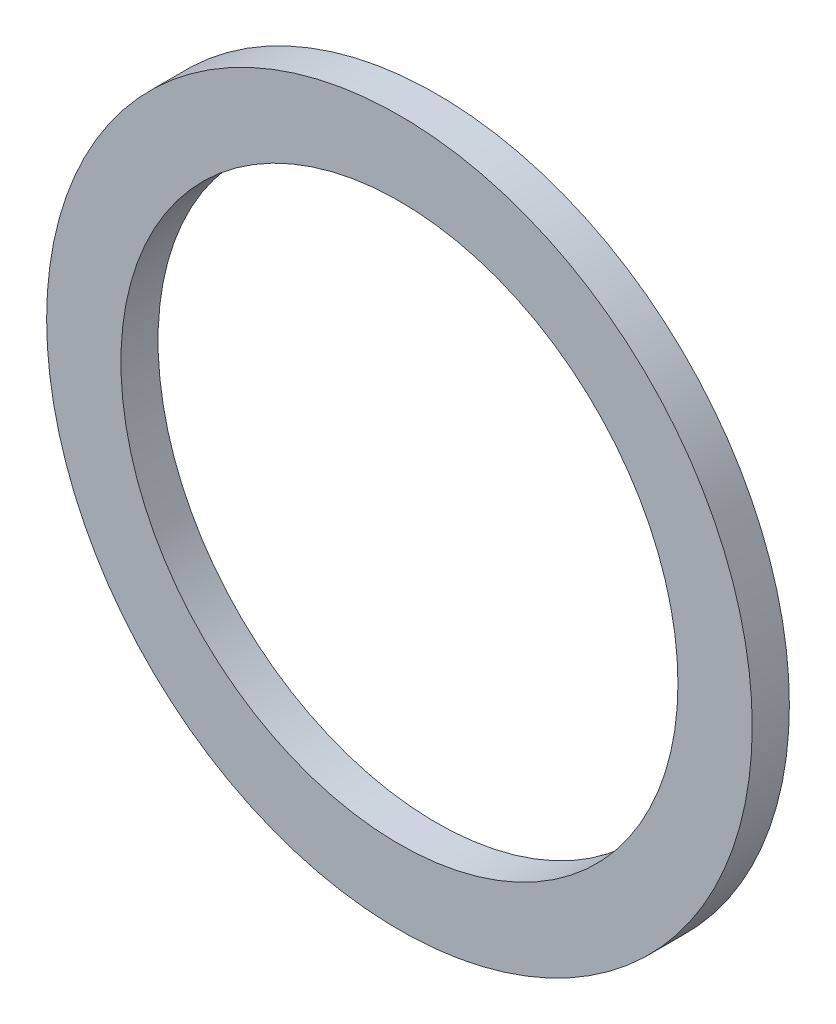
ISO-10303-21;
HEADER;
FILE_DESCRIPTION(('STEP AP214'),'2;1');
FILE_NAME('part.step','',(''),(''),'','','');
FILE_SCHEMA(('AUTOMOTIVE_DESIGN { 1 0 10303 214 1 1 1 1 }'));
ENDSEC;
DATA;
#1=APPLICATION_CONTEXT('core data for automotive mechanical design processes');
#2=APPLICATION_PROTOCOL_DEFINITION('international standard','automotive_design',2000,#1);
#3=PRODUCT_CONTEXT('',#1,'mechanical');
#4=PRODUCT('Part','Part','',(#3));
#5=PRODUCT_RELATED_PRODUCT_CATEGORY('part','',(#4));
#6=PRODUCT_DEFINITION_FORMATION('','',#4);
#7=PRODUCT_DEFINITION_CONTEXT('part definition',#1,'design');
#8=PRODUCT_DEFINITION('design','',#6,#7);
#9=PRODUCT_DEFINITION_SHAPE('','',#8);
#10=(LENGTH_UNIT() NAMED_UNIT(*) SI_UNIT(.MILLI.,.METRE.));
#11=(NAMED_UNIT(*) PLANE_ANGLE_UNIT() SI_UNIT($,.RADIAN.));
#12=(NAMED_UNIT(*) SI_UNIT($,.STERADIAN.) SOLID_ANGLE_UNIT());
#13=UNCERTAINTY_MEASURE_WITH_UNIT(LENGTH_MEASURE(1.E-05),#10,'distance_accuracy_value','');
#14=(GEOMETRIC_REPRESENTATION_CONTEXT(3) GLOBAL_UNCERTAINTY_ASSIGNED_CONTEXT((#13)) GLOBAL_UNIT_ASSIGNED_CONTEXT((#10,
#11,#12)) REPRESENTATION_CONTEXT('',''));
#15=CARTESIAN_POINT('',(0.,0.,0.));
#16=DIRECTION('',(0.,0.,1.));
#17=DIRECTION('',(1.,0.,0.));
#18=AXIS2_PLACEMENT_3D('',#15,#16,#17);
#19=CARTESIAN_POINT('',(0.,0.,2.));
#20=DIRECTION('',(0.,0.,1.));
#21=DIRECTION('',(1.,0.,0.));
#22=AXIS2_PLACEMENT_3D('',#19,#20,#21);
#23=PLANE('',#22);
#24=CARTESIAN_POINT('',(0.,0.,2.));
#25=DIRECTION('',(0.,0.,1.));
#26=DIRECTION('',(1.,0.,0.));
#27=AXIS2_PLACEMENT_3D('',#24,#25,#26);
#28=CIRCLE('',#27,19.);
#29=CARTESIAN_POINT('',(19.,0.,2.));
#30=VERTEX_POINT('',#29);
#31=EDGE_CURVE('E10',#30,#30,#28,.T.);
#32=ORIENTED_EDGE('',*,*,#31,.T.);
#33=EDGE_LOOP('',(#32));
#34=FACE_BOUND('',#33,.T.);
#35=CARTESIAN_POINT('',(0.,0.,2.));
#36=DIRECTION('',(0.,0.,1.));
#37=DIRECTION('',(1.,0.,0.));
#38=AXIS2_PLACEMENT_3D('',#35,#36,#37);
#39=CIRCLE('',#38,15.);
#40=CARTESIAN_POINT('',(15.,0.,2.));
#41=VERTEX_POINT('',#40);
#42=EDGE_CURVE('E40',#41,#41,#39,.T.);
#43=ORIENTED_EDGE('',*,*,#42,.F.);
#44=EDGE_LOOP('',(#43));
#45=FACE_BOUND('',#44,.T.);
#46=ADVANCED_FACE('F29',(#34,#45),#23,.T.);
#47=CARTESIAN_POINT('',(0.,0.,0.));
#48=DIRECTION('',(0.,0.,1.));
#49=DIRECTION('',(1.,0.,0.));
#50=AXIS2_PLACEMENT_3D('',#47,#48,#49);
#51=PLANE('',#50);
#52=CARTESIAN_POINT('',(0.,0.,0.));
#53=DIRECTION('',(0.,0.,1.));
#54=DIRECTION('',(1.,0.,0.));
#55=AXIS2_PLACEMENT_3D('',#52,#53,#54);
#56=CIRCLE('',#55,19.);
#57=CARTESIAN_POINT('',(19.,0.,0.));
#58=VERTEX_POINT('',#57);
#59=EDGE_CURVE('E33',#58,#58,#56,.T.);
#60=ORIENTED_EDGE('',*,*,#59,.F.);
#61=EDGE_LOOP('',(#60));
#62=FACE_BOUND('',#61,.T.);
#63=CARTESIAN_POINT('',(0.,0.,0.));
#64=DIRECTION('',(0.,0.,1.));
#65=DIRECTION('',(1.,0.,0.));
#66=AXIS2_PLACEMENT_3D('',#63,#64,#65);
#67=CIRCLE('',#66,15.);
#68=CARTESIAN_POINT('',(15.,0.,0.));
#69=VERTEX_POINT('',#68);
#70=EDGE_CURVE('E42',#69,#69,#67,.T.);
#71=ORIENTED_EDGE('',*,*,#70,.T.);
#72=EDGE_LOOP('',(#71));
#73=FACE_BOUND('',#72,.T.);
#74=ADVANCED_FACE('F52',(#62,#73),#51,.F.);
#75=CARTESIAN_POINT('',(0.,0.,2.));
#76=DIRECTION('',(0.,0.,-1.));
#77=DIRECTION('',(-1.,0.,0.));
#78=AXIS2_PLACEMENT_3D('',#75,#76,#77);
#79=CYLINDRICAL_SURFACE('',#78,19.);
#80=ORIENTED_EDGE('',*,*,#31,.F.);
#81=EDGE_LOOP('',(#80));
#82=FACE_BOUND('',#81,.T.);
#83=ORIENTED_EDGE('',*,*,#59,.T.);
#84=EDGE_LOOP('',(#83));
#85=FACE_BOUND('',#84,.T.);
#86=ADVANCED_FACE('F31',(#82,#85),#79,.T.);
#87=CARTESIAN_POINT('',(0.,0.,2.));
#88=DIRECTION('',(0.,0.,-1.));
#89=DIRECTION('',(-1.,0.,0.));
#90=AXIS2_PLACEMENT_3D('',#87,#88,#89);
#91=CYLINDRICAL_SURFACE('',#90,15.);
#92=ORIENTED_EDGE('',*,*,#42,.T.);
#93=EDGE_LOOP('',(#92));
#94=FACE_BOUND('',#93,.T.);
#95=ORIENTED_EDGE('',*,*,#70,.F.);
#96=EDGE_LOOP('',(#95));
#97=FACE_BOUND('',#96,.T.);
#98=ADVANCED_FACE('F48',(#94,#97),#91,.F.);
#99=CLOSED_SHELL('',(#46,#74,#86,#98));
#100=MANIFOLD_SOLID_BREP('B2',#99);
#101=ADVANCED_BREP_SHAPE_REPRESENTATION('',(#18,#100),#14);
#102=SHAPE_DEFINITION_REPRESENTATION(#9,#101);
ENDSEC;
END-ISO-10303-21;
